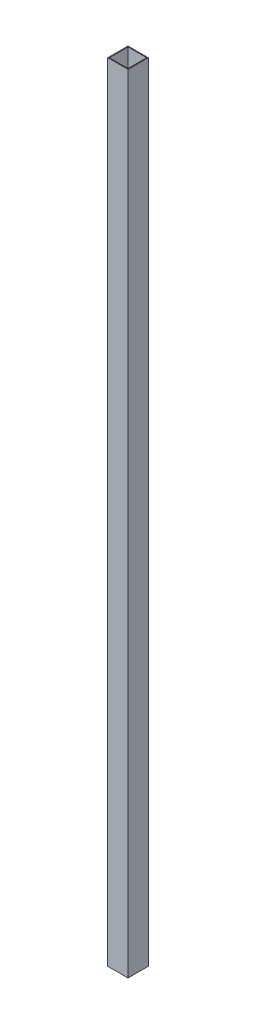
ISO-10303-21;
HEADER;
FILE_DESCRIPTION(('STEP AP214'),'2;1');
FILE_NAME('part.step','',(''),(''),'','','');
FILE_SCHEMA(('AUTOMOTIVE_DESIGN { 1 0 10303 214 1 1 1 1 }'));
ENDSEC;
DATA;
#1=APPLICATION_CONTEXT('core data for automotive mechanical design processes');
#2=APPLICATION_PROTOCOL_DEFINITION('international standard','automotive_design',2000,#1);
#3=PRODUCT_CONTEXT('',#1,'mechanical');
#4=PRODUCT('Part','Part','',(#3));
#5=PRODUCT_RELATED_PRODUCT_CATEGORY('part','',(#4));
#6=PRODUCT_DEFINITION_FORMATION('','',#4);
#7=PRODUCT_DEFINITION_CONTEXT('part definition',#1,'design');
#8=PRODUCT_DEFINITION('design','',#6,#7);
#9=PRODUCT_DEFINITION_SHAPE('','',#8);
#10=(LENGTH_UNIT() NAMED_UNIT(*) SI_UNIT(.MILLI.,.METRE.));
#11=(NAMED_UNIT(*) PLANE_ANGLE_UNIT() SI_UNIT($,.RADIAN.));
#12=(NAMED_UNIT(*) SI_UNIT($,.STERADIAN.) SOLID_ANGLE_UNIT());
#13=UNCERTAINTY_MEASURE_WITH_UNIT(LENGTH_MEASURE(1.E-05),#10,'distance_accuracy_value','');
#14=(GEOMETRIC_REPRESENTATION_CONTEXT(3) GLOBAL_UNCERTAINTY_ASSIGNED_CONTEXT((#13)) GLOBAL_UNIT_ASSIGNED_CONTEXT((#10,
#11,#12)) REPRESENTATION_CONTEXT('',''));
#15=CARTESIAN_POINT('',(0.,0.,0.));
#16=DIRECTION('',(0.,0.,1.));
#17=DIRECTION('',(1.,0.,0.));
#18=AXIS2_PLACEMENT_3D('',#15,#16,#17);
#19=CARTESIAN_POINT('',(0.,971.,0.));
#20=DIRECTION('',(0.,-1.,0.));
#21=DIRECTION('',(0.,0.,-1.));
#22=AXIS2_PLACEMENT_3D('',#19,#20,#21);
#23=PLANE('',#22);
#24=DIRECTION('',(0.,0.,-1.));
#25=VECTOR('',#24,1.);
#26=CARTESIAN_POINT('',(12.5,971.,12.5));
#27=LINE('',#26,#25);
#28=CARTESIAN_POINT('',(12.5,971.,12.5));
#29=VERTEX_POINT('',#28);
#30=CARTESIAN_POINT('',(12.5,971.,-12.5));
#31=VERTEX_POINT('',#30);
#32=EDGE_CURVE('E140',#29,#31,#27,.T.);
#33=ORIENTED_EDGE('',*,*,#32,.T.);
#34=DIRECTION('',(-1.,0.,0.));
#35=VECTOR('',#34,1.);
#36=CARTESIAN_POINT('',(-12.5,971.,-12.5));
#37=LINE('',#36,#35);
#38=CARTESIAN_POINT('',(-12.5,971.,-12.5));
#39=VERTEX_POINT('',#38);
#40=EDGE_CURVE('E143',#31,#39,#37,.T.);
#41=ORIENTED_EDGE('',*,*,#40,.T.);
#42=DIRECTION('',(0.,0.,1.));
#43=VECTOR('',#42,1.);
#44=CARTESIAN_POINT('',(-12.5,971.,12.5));
#45=LINE('',#44,#43);
#46=CARTESIAN_POINT('',(-12.5,971.,12.5));
#47=VERTEX_POINT('',#46);
#48=EDGE_CURVE('E146',#39,#47,#45,.T.);
#49=ORIENTED_EDGE('',*,*,#48,.T.);
#50=DIRECTION('',(1.,0.,0.));
#51=VECTOR('',#50,1.);
#52=CARTESIAN_POINT('',(-12.5,971.,12.5));
#53=LINE('',#52,#51);
#54=EDGE_CURVE('E148',#47,#29,#53,.T.);
#55=ORIENTED_EDGE('',*,*,#54,.T.);
#56=EDGE_LOOP('',(#33,#41,#49,#55));
#57=FACE_BOUND('',#56,.T.);
#58=DIRECTION('',(0.,0.,1.));
#59=VECTOR('',#58,1.);
#60=CARTESIAN_POINT('',(-11.5,971.,11.5));
#61=LINE('',#60,#59);
#62=CARTESIAN_POINT('',(-11.5,971.,-11.5));
#63=VERTEX_POINT('',#62);
#64=CARTESIAN_POINT('',(-11.5,971.,11.5));
#65=VERTEX_POINT('',#64);
#66=EDGE_CURVE('E104',#63,#65,#61,.T.);
#67=ORIENTED_EDGE('',*,*,#66,.F.);
#68=DIRECTION('',(-1.,0.,0.));
#69=VECTOR('',#68,1.);
#70=CARTESIAN_POINT('',(-11.5,971.,-11.5));
#71=LINE('',#70,#69);
#72=CARTESIAN_POINT('',(11.5,971.,-11.5));
#73=VERTEX_POINT('',#72);
#74=EDGE_CURVE('E126',#73,#63,#71,.T.);
#75=ORIENTED_EDGE('',*,*,#74,.F.);
#76=DIRECTION('',(0.,0.,-1.));
#77=VECTOR('',#76,1.);
#78=CARTESIAN_POINT('',(11.5,971.,11.5));
#79=LINE('',#78,#77);
#80=CARTESIAN_POINT('',(11.5,971.,11.5));
#81=VERTEX_POINT('',#80);
#82=EDGE_CURVE('E124',#81,#73,#79,.T.);
#83=ORIENTED_EDGE('',*,*,#82,.F.);
#84=DIRECTION('',(1.,0.,0.));
#85=VECTOR('',#84,1.);
#86=CARTESIAN_POINT('',(-11.5,971.,11.5));
#87=LINE('',#86,#85);
#88=EDGE_CURVE('E112',#65,#81,#87,.T.);
#89=ORIENTED_EDGE('',*,*,#88,.F.);
#90=EDGE_LOOP('',(#67,#75,#83,#89));
#91=FACE_BOUND('',#90,.T.);
#92=ADVANCED_FACE('F39',(#57,#91),#23,.F.);
#93=CARTESIAN_POINT('',(0.,0.,0.));
#94=DIRECTION('',(0.,-1.,0.));
#95=DIRECTION('',(0.,0.,-1.));
#96=AXIS2_PLACEMENT_3D('',#93,#94,#95);
#97=PLANE('',#96);
#98=DIRECTION('',(0.,0.,-1.));
#99=VECTOR('',#98,1.);
#100=CARTESIAN_POINT('',(12.5,0.,12.5));
#101=LINE('',#100,#99);
#102=CARTESIAN_POINT('',(12.5,0.,12.5));
#103=VERTEX_POINT('',#102);
#104=CARTESIAN_POINT('',(12.5,0.,-12.5));
#105=VERTEX_POINT('',#104);
#106=EDGE_CURVE('E120',#103,#105,#101,.T.);
#107=ORIENTED_EDGE('',*,*,#106,.F.);
#108=DIRECTION('',(1.,0.,0.));
#109=VECTOR('',#108,1.);
#110=CARTESIAN_POINT('',(-12.5,0.,12.5));
#111=LINE('',#110,#109);
#112=CARTESIAN_POINT('',(-12.5,0.,12.5));
#113=VERTEX_POINT('',#112);
#114=EDGE_CURVE('E144',#113,#103,#111,.T.);
#115=ORIENTED_EDGE('',*,*,#114,.F.);
#116=DIRECTION('',(0.,0.,1.));
#117=VECTOR('',#116,1.);
#118=CARTESIAN_POINT('',(-12.5,0.,12.5));
#119=LINE('',#118,#117);
#120=CARTESIAN_POINT('',(-12.5,0.,-12.5));
#121=VERTEX_POINT('',#120);
#122=EDGE_CURVE('E155',#121,#113,#119,.T.);
#123=ORIENTED_EDGE('',*,*,#122,.F.);
#124=DIRECTION('',(-1.,0.,0.));
#125=VECTOR('',#124,1.);
#126=CARTESIAN_POINT('',(-12.5,0.,-12.5));
#127=LINE('',#126,#125);
#128=EDGE_CURVE('E153',#105,#121,#127,.T.);
#129=ORIENTED_EDGE('',*,*,#128,.F.);
#130=EDGE_LOOP('',(#107,#115,#123,#129));
#131=FACE_BOUND('',#130,.T.);
#132=DIRECTION('',(-1.,0.,0.));
#133=VECTOR('',#132,1.);
#134=CARTESIAN_POINT('',(-11.5,0.,-11.5));
#135=LINE('',#134,#133);
#136=CARTESIAN_POINT('',(11.5,0.,-11.5));
#137=VERTEX_POINT('',#136);
#138=CARTESIAN_POINT('',(-11.5,0.,-11.5));
#139=VERTEX_POINT('',#138);
#140=EDGE_CURVE('E113',#137,#139,#135,.T.);
#141=ORIENTED_EDGE('',*,*,#140,.T.);
#142=DIRECTION('',(0.,0.,1.));
#143=VECTOR('',#142,1.);
#144=CARTESIAN_POINT('',(-11.5,0.,11.5));
#145=LINE('',#144,#143);
#146=CARTESIAN_POINT('',(-11.5,0.,11.5));
#147=VERTEX_POINT('',#146);
#148=EDGE_CURVE('E62',#139,#147,#145,.T.);
#149=ORIENTED_EDGE('',*,*,#148,.T.);
#150=DIRECTION('',(1.,0.,0.));
#151=VECTOR('',#150,1.);
#152=CARTESIAN_POINT('',(-11.5,0.,11.5));
#153=LINE('',#152,#151);
#154=CARTESIAN_POINT('',(11.5,0.,11.5));
#155=VERTEX_POINT('',#154);
#156=EDGE_CURVE('E119',#147,#155,#153,.T.);
#157=ORIENTED_EDGE('',*,*,#156,.T.);
#158=DIRECTION('',(0.,0.,-1.));
#159=VECTOR('',#158,1.);
#160=CARTESIAN_POINT('',(11.5,0.,11.5));
#161=LINE('',#160,#159);
#162=EDGE_CURVE('E132',#155,#137,#161,.T.);
#163=ORIENTED_EDGE('',*,*,#162,.T.);
#164=EDGE_LOOP('',(#141,#149,#157,#163));
#165=FACE_BOUND('',#164,.T.);
#166=ADVANCED_FACE('F173',(#131,#165),#97,.T.);
#167=CARTESIAN_POINT('',(12.5,971.,12.5));
#168=DIRECTION('',(-1.,0.,0.));
#169=DIRECTION('',(0.,0.,1.));
#170=AXIS2_PLACEMENT_3D('',#167,#168,#169);
#171=PLANE('',#170);
#172=ORIENTED_EDGE('',*,*,#106,.T.);
#173=DIRECTION('',(0.,-1.,0.));
#174=VECTOR('',#173,1.);
#175=CARTESIAN_POINT('',(12.5,971.,-12.5));
#176=LINE('',#175,#174);
#177=EDGE_CURVE('E11',#31,#105,#176,.T.);
#178=ORIENTED_EDGE('',*,*,#177,.F.);
#179=ORIENTED_EDGE('',*,*,#32,.F.);
#180=DIRECTION('',(0.,-1.,0.));
#181=VECTOR('',#180,1.);
#182=CARTESIAN_POINT('',(12.5,971.,12.5));
#183=LINE('',#182,#181);
#184=EDGE_CURVE('E150',#29,#103,#183,.T.);
#185=ORIENTED_EDGE('',*,*,#184,.T.);
#186=EDGE_LOOP('',(#172,#178,#179,#185));
#187=FACE_BOUND('',#186,.T.);
#188=ADVANCED_FACE('F41',(#187),#171,.F.);
#189=CARTESIAN_POINT('',(-12.5,971.,-12.5));
#190=DIRECTION('',(0.,0.,1.));
#191=DIRECTION('',(1.,0.,0.));
#192=AXIS2_PLACEMENT_3D('',#189,#190,#191);
#193=PLANE('',#192);
#194=ORIENTED_EDGE('',*,*,#128,.T.);
#195=DIRECTION('',(0.,-1.,0.));
#196=VECTOR('',#195,1.);
#197=CARTESIAN_POINT('',(-12.5,971.,-12.5));
#198=LINE('',#197,#196);
#199=EDGE_CURVE('E47',#39,#121,#198,.T.);
#200=ORIENTED_EDGE('',*,*,#199,.F.);
#201=ORIENTED_EDGE('',*,*,#40,.F.);
#202=ORIENTED_EDGE('',*,*,#177,.T.);
#203=EDGE_LOOP('',(#194,#200,#201,#202));
#204=FACE_BOUND('',#203,.T.);
#205=ADVANCED_FACE('F183',(#204),#193,.F.);
#206=CARTESIAN_POINT('',(-12.5,971.,12.5));
#207=DIRECTION('',(1.,0.,0.));
#208=DIRECTION('',(0.,0.,-1.));
#209=AXIS2_PLACEMENT_3D('',#206,#207,#208);
#210=PLANE('',#209);
#211=ORIENTED_EDGE('',*,*,#122,.T.);
#212=DIRECTION('',(0.,-1.,0.));
#213=VECTOR('',#212,1.);
#214=CARTESIAN_POINT('',(-12.5,971.,12.5));
#215=LINE('',#214,#213);
#216=EDGE_CURVE('E160',#47,#113,#215,.T.);
#217=ORIENTED_EDGE('',*,*,#216,.F.);
#218=ORIENTED_EDGE('',*,*,#48,.F.);
#219=ORIENTED_EDGE('',*,*,#199,.T.);
#220=EDGE_LOOP('',(#211,#217,#218,#219));
#221=FACE_BOUND('',#220,.T.);
#222=ADVANCED_FACE('F167',(#221),#210,.F.);
#223=CARTESIAN_POINT('',(-12.5,971.,12.5));
#224=DIRECTION('',(0.,0.,-1.));
#225=DIRECTION('',(-1.,0.,0.));
#226=AXIS2_PLACEMENT_3D('',#223,#224,#225);
#227=PLANE('',#226);
#228=ORIENTED_EDGE('',*,*,#114,.T.);
#229=ORIENTED_EDGE('',*,*,#184,.F.);
#230=ORIENTED_EDGE('',*,*,#54,.F.);
#231=ORIENTED_EDGE('',*,*,#216,.T.);
#232=EDGE_LOOP('',(#228,#229,#230,#231));
#233=FACE_BOUND('',#232,.T.);
#234=ADVANCED_FACE('F177',(#233),#227,.F.);
#235=CARTESIAN_POINT('',(-11.5,971.,11.5));
#236=DIRECTION('',(1.,0.,0.));
#237=DIRECTION('',(0.,0.,-1.));
#238=AXIS2_PLACEMENT_3D('',#235,#236,#237);
#239=PLANE('',#238);
#240=ORIENTED_EDGE('',*,*,#148,.F.);
#241=DIRECTION('',(0.,-1.,0.));
#242=VECTOR('',#241,1.);
#243=CARTESIAN_POINT('',(-11.5,971.,-11.5));
#244=LINE('',#243,#242);
#245=EDGE_CURVE('E108',#63,#139,#244,.T.);
#246=ORIENTED_EDGE('',*,*,#245,.F.);
#247=ORIENTED_EDGE('',*,*,#66,.T.);
#248=DIRECTION('',(0.,-1.,0.));
#249=VECTOR('',#248,1.);
#250=CARTESIAN_POINT('',(-11.5,971.,11.5));
#251=LINE('',#250,#249);
#252=EDGE_CURVE('E107',#65,#147,#251,.T.);
#253=ORIENTED_EDGE('',*,*,#252,.T.);
#254=EDGE_LOOP('',(#240,#246,#247,#253));
#255=FACE_BOUND('',#254,.T.);
#256=ADVANCED_FACE('F106',(#255),#239,.T.);
#257=CARTESIAN_POINT('',(-11.5,971.,11.5));
#258=DIRECTION('',(0.,0.,-1.));
#259=DIRECTION('',(-1.,0.,0.));
#260=AXIS2_PLACEMENT_3D('',#257,#258,#259);
#261=PLANE('',#260);
#262=ORIENTED_EDGE('',*,*,#156,.F.);
#263=ORIENTED_EDGE('',*,*,#252,.F.);
#264=ORIENTED_EDGE('',*,*,#88,.T.);
#265=DIRECTION('',(0.,-1.,0.));
#266=VECTOR('',#265,1.);
#267=CARTESIAN_POINT('',(11.5,971.,11.5));
#268=LINE('',#267,#266);
#269=EDGE_CURVE('E121',#81,#155,#268,.T.);
#270=ORIENTED_EDGE('',*,*,#269,.T.);
#271=EDGE_LOOP('',(#262,#263,#264,#270));
#272=FACE_BOUND('',#271,.T.);
#273=ADVANCED_FACE('F116',(#272),#261,.T.);
#274=CARTESIAN_POINT('',(11.5,971.,11.5));
#275=DIRECTION('',(-1.,0.,0.));
#276=DIRECTION('',(0.,0.,1.));
#277=AXIS2_PLACEMENT_3D('',#274,#275,#276);
#278=PLANE('',#277);
#279=ORIENTED_EDGE('',*,*,#162,.F.);
#280=ORIENTED_EDGE('',*,*,#269,.F.);
#281=ORIENTED_EDGE('',*,*,#82,.T.);
#282=DIRECTION('',(0.,-1.,0.));
#283=VECTOR('',#282,1.);
#284=CARTESIAN_POINT('',(11.5,971.,-11.5));
#285=LINE('',#284,#283);
#286=EDGE_CURVE('E54',#73,#137,#285,.T.);
#287=ORIENTED_EDGE('',*,*,#286,.T.);
#288=EDGE_LOOP('',(#279,#280,#281,#287));
#289=FACE_BOUND('',#288,.T.);
#290=ADVANCED_FACE('F206',(#289),#278,.T.);
#291=CARTESIAN_POINT('',(-11.5,971.,-11.5));
#292=DIRECTION('',(0.,0.,1.));
#293=DIRECTION('',(1.,0.,0.));
#294=AXIS2_PLACEMENT_3D('',#291,#292,#293);
#295=PLANE('',#294);
#296=ORIENTED_EDGE('',*,*,#140,.F.);
#297=ORIENTED_EDGE('',*,*,#286,.F.);
#298=ORIENTED_EDGE('',*,*,#74,.T.);
#299=ORIENTED_EDGE('',*,*,#245,.T.);
#300=EDGE_LOOP('',(#296,#297,#298,#299));
#301=FACE_BOUND('',#300,.T.);
#302=ADVANCED_FACE('F210',(#301),#295,.T.);
#303=CLOSED_SHELL('',(#92,#166,#188,#205,#222,#234,#256,#273,#290,#302));
#304=MANIFOLD_SOLID_BREP('B2',#303);
#305=ADVANCED_BREP_SHAPE_REPRESENTATION('',(#18,#304),#14);
#306=SHAPE_DEFINITION_REPRESENTATION(#9,#305);
ENDSEC;
END-ISO-10303-21;
